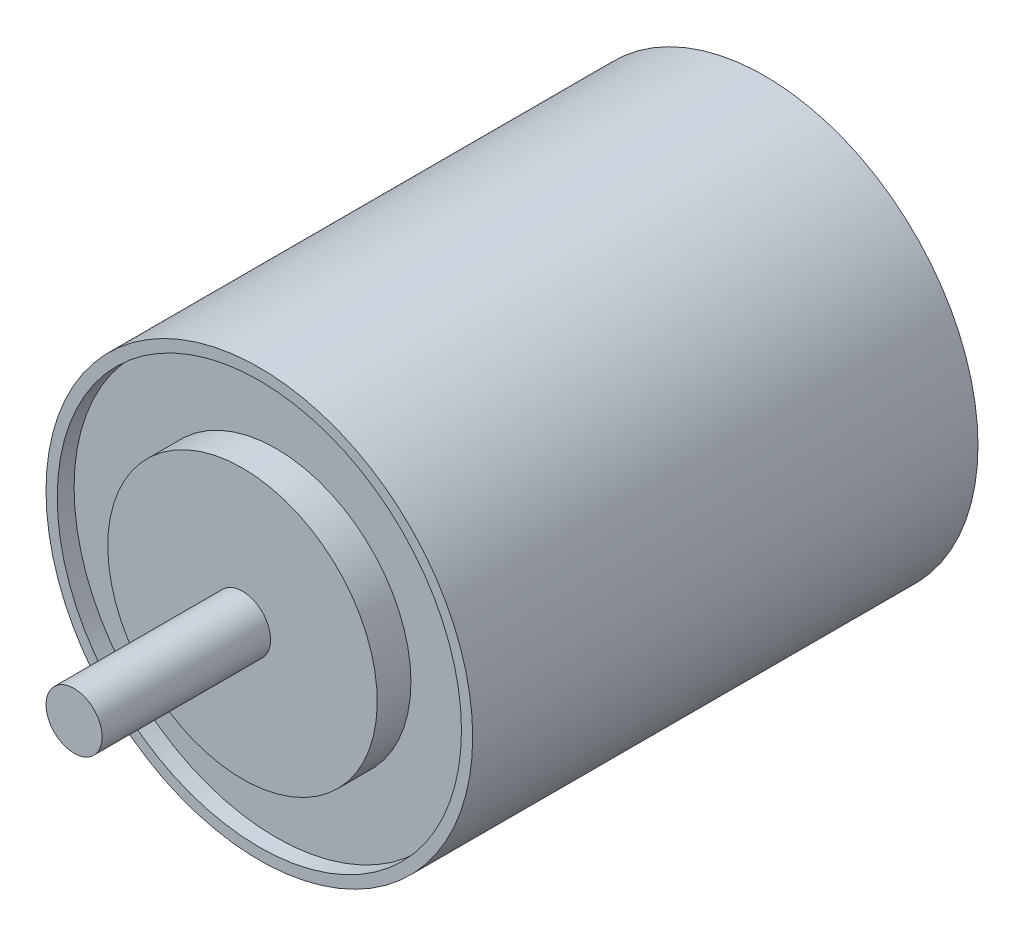
ISO-10303-21;
HEADER;
FILE_DESCRIPTION(('STEP AP214'),'2;1');
FILE_NAME('part.step','',(''),(''),'','','');
FILE_SCHEMA(('AUTOMOTIVE_DESIGN { 1 0 10303 214 1 1 1 1 }'));
ENDSEC;
DATA;
#1=APPLICATION_CONTEXT('core data for automotive mechanical design processes');
#2=APPLICATION_PROTOCOL_DEFINITION('international standard','automotive_design',2000,#1);
#3=PRODUCT_CONTEXT('',#1,'mechanical');
#4=PRODUCT('Part','Part','',(#3));
#5=PRODUCT_RELATED_PRODUCT_CATEGORY('part','',(#4));
#6=PRODUCT_DEFINITION_FORMATION('','',#4);
#7=PRODUCT_DEFINITION_CONTEXT('part definition',#1,'design');
#8=PRODUCT_DEFINITION('design','',#6,#7);
#9=PRODUCT_DEFINITION_SHAPE('','',#8);
#10=(LENGTH_UNIT() NAMED_UNIT(*) SI_UNIT(.MILLI.,.METRE.));
#11=(NAMED_UNIT(*) PLANE_ANGLE_UNIT() SI_UNIT($,.RADIAN.));
#12=(NAMED_UNIT(*) SI_UNIT($,.STERADIAN.) SOLID_ANGLE_UNIT());
#13=UNCERTAINTY_MEASURE_WITH_UNIT(LENGTH_MEASURE(1.E-05),#10,'distance_accuracy_value','');
#14=(GEOMETRIC_REPRESENTATION_CONTEXT(3) GLOBAL_UNCERTAINTY_ASSIGNED_CONTEXT((#13)) GLOBAL_UNIT_ASSIGNED_CONTEXT((#10,
#11,#12)) REPRESENTATION_CONTEXT('',''));
#15=CARTESIAN_POINT('',(0.,0.,0.));
#16=DIRECTION('',(0.,0.,1.));
#17=DIRECTION('',(1.,0.,0.));
#18=AXIS2_PLACEMENT_3D('',#15,#16,#17);
#19=CARTESIAN_POINT('',(0.,-190.,309.593023255814));
#20=DIRECTION('',(0.,0.,1.));
#21=DIRECTION('',(1.,0.,0.));
#22=AXIS2_PLACEMENT_3D('',#19,#20,#21);
#23=PLANE('',#22);
#24=CARTESIAN_POINT('',(0.,-190.,309.593023255814));
#25=DIRECTION('',(0.,0.,1.));
#26=DIRECTION('',(1.,0.,0.));
#27=AXIS2_PLACEMENT_3D('',#24,#25,#26);
#28=CIRCLE('',#27,120.);
#29=CARTESIAN_POINT('',(120.,-190.,309.593023255814));
#30=VERTEX_POINT('',#29);
#31=EDGE_CURVE('E50',#30,#30,#28,.T.);
#32=ORIENTED_EDGE('',*,*,#31,.F.);
#33=EDGE_LOOP('',(#32));
#34=FACE_BOUND('',#33,.T.);
#35=CARTESIAN_POINT('',(0.,-190.,309.593023255814));
#36=DIRECTION('',(0.,0.,1.));
#37=DIRECTION('',(1.,0.,0.));
#38=AXIS2_PLACEMENT_3D('',#35,#36,#37);
#39=CIRCLE('',#38,180.);
#40=CARTESIAN_POINT('',(180.,-190.,309.593023255814));
#41=VERTEX_POINT('',#40);
#42=EDGE_CURVE('E102',#41,#41,#39,.T.);
#43=ORIENTED_EDGE('',*,*,#42,.T.);
#44=EDGE_LOOP('',(#43));
#45=FACE_BOUND('',#44,.T.);
#46=ADVANCED_FACE('F46',(#34,#45),#23,.T.);
#47=CARTESIAN_POINT('',(0.,-190.,309.593023255814));
#48=DIRECTION('',(0.,0.,1.));
#49=DIRECTION('',(1.,0.,0.));
#50=AXIS2_PLACEMENT_3D('',#47,#48,#49);
#51=CYLINDRICAL_SURFACE('',#50,180.);
#52=CARTESIAN_POINT('',(0.,-190.,324.593023255814));
#53=DIRECTION('',(0.,0.,1.));
#54=DIRECTION('',(1.,0.,0.));
#55=AXIS2_PLACEMENT_3D('',#52,#53,#54);
#56=CIRCLE('',#55,180.);
#57=CARTESIAN_POINT('',(180.,-190.,324.593023255814));
#58=VERTEX_POINT('',#57);
#59=EDGE_CURVE('E98',#58,#58,#56,.T.);
#60=ORIENTED_EDGE('',*,*,#59,.T.);
#61=EDGE_LOOP('',(#60));
#62=FACE_BOUND('',#61,.T.);
#63=ORIENTED_EDGE('',*,*,#42,.F.);
#64=EDGE_LOOP('',(#63));
#65=FACE_BOUND('',#64,.T.);
#66=ADVANCED_FACE('F122',(#62,#65),#51,.F.);
#67=CARTESIAN_POINT('',(0.,-10.,324.593023255814));
#68=DIRECTION('',(0.,0.,1.));
#69=DIRECTION('',(1.,0.,0.));
#70=AXIS2_PLACEMENT_3D('',#67,#68,#69);
#71=PLANE('',#70);
#72=CARTESIAN_POINT('',(0.,-190.,324.593023255814));
#73=DIRECTION('',(0.,0.,1.));
#74=DIRECTION('',(1.,0.,0.));
#75=AXIS2_PLACEMENT_3D('',#72,#73,#74);
#76=CIRCLE('',#75,190.);
#77=CARTESIAN_POINT('',(190.,-190.,324.593023255814));
#78=VERTEX_POINT('',#77);
#79=EDGE_CURVE('E94',#78,#78,#76,.T.);
#80=ORIENTED_EDGE('',*,*,#79,.T.);
#81=EDGE_LOOP('',(#80));
#82=FACE_BOUND('',#81,.T.);
#83=ORIENTED_EDGE('',*,*,#59,.F.);
#84=EDGE_LOOP('',(#83));
#85=FACE_BOUND('',#84,.T.);
#86=ADVANCED_FACE('F127',(#82,#85),#71,.T.);
#87=CARTESIAN_POINT('',(0.,-190.,309.593023255814));
#88=DIRECTION('',(0.,0.,1.));
#89=DIRECTION('',(1.,0.,0.));
#90=AXIS2_PLACEMENT_3D('',#87,#88,#89);
#91=CYLINDRICAL_SURFACE('',#90,190.);
#92=CARTESIAN_POINT('',(0.,-190.,-125.406976744186));
#93=DIRECTION('',(0.,0.,1.));
#94=DIRECTION('',(1.,0.,0.));
#95=AXIS2_PLACEMENT_3D('',#92,#93,#94);
#96=CIRCLE('',#95,190.);
#97=CARTESIAN_POINT('',(190.,-190.,-125.406976744186));
#98=VERTEX_POINT('',#97);
#99=EDGE_CURVE('E90',#98,#98,#96,.T.);
#100=ORIENTED_EDGE('',*,*,#99,.T.);
#101=EDGE_LOOP('',(#100));
#102=FACE_BOUND('',#101,.T.);
#103=ORIENTED_EDGE('',*,*,#79,.F.);
#104=EDGE_LOOP('',(#103));
#105=FACE_BOUND('',#104,.T.);
#106=ADVANCED_FACE('F133',(#102,#105),#91,.T.);
#107=CARTESIAN_POINT('',(0.,0.,-125.406976744186));
#108=DIRECTION('',(0.,0.,-1.));
#109=DIRECTION('',(-1.,0.,0.));
#110=AXIS2_PLACEMENT_3D('',#107,#108,#109);
#111=PLANE('',#110);
#112=CARTESIAN_POINT('',(0.,-190.,-125.406976744186));
#113=DIRECTION('',(0.,0.,1.));
#114=DIRECTION('',(1.,0.,0.));
#115=AXIS2_PLACEMENT_3D('',#112,#113,#114);
#116=CIRCLE('',#115,180.);
#117=CARTESIAN_POINT('',(180.,-190.,-125.406976744186));
#118=VERTEX_POINT('',#117);
#119=EDGE_CURVE('E86',#118,#118,#116,.T.);
#120=ORIENTED_EDGE('',*,*,#119,.T.);
#121=EDGE_LOOP('',(#120));
#122=FACE_BOUND('',#121,.T.);
#123=ORIENTED_EDGE('',*,*,#99,.F.);
#124=EDGE_LOOP('',(#123));
#125=FACE_BOUND('',#124,.T.);
#126=ADVANCED_FACE('F162',(#122,#125),#111,.T.);
#127=CARTESIAN_POINT('',(0.,-190.,309.593023255814));
#128=DIRECTION('',(0.,0.,1.));
#129=DIRECTION('',(1.,0.,0.));
#130=AXIS2_PLACEMENT_3D('',#127,#128,#129);
#131=CYLINDRICAL_SURFACE('',#130,180.);
#132=CARTESIAN_POINT('',(0.,-190.,-110.406976744186));
#133=DIRECTION('',(0.,0.,1.));
#134=DIRECTION('',(1.,0.,0.));
#135=AXIS2_PLACEMENT_3D('',#132,#133,#134);
#136=CIRCLE('',#135,180.);
#137=CARTESIAN_POINT('',(180.,-190.,-110.406976744186));
#138=VERTEX_POINT('',#137);
#139=EDGE_CURVE('E79',#138,#138,#136,.T.);
#140=ORIENTED_EDGE('',*,*,#139,.T.);
#141=EDGE_LOOP('',(#140));
#142=FACE_BOUND('',#141,.T.);
#143=ORIENTED_EDGE('',*,*,#119,.F.);
#144=EDGE_LOOP('',(#143));
#145=FACE_BOUND('',#144,.T.);
#146=ADVANCED_FACE('F157',(#142,#145),#131,.F.);
#147=CARTESIAN_POINT('',(0.,-9.99999999999995,-110.406976744186));
#148=DIRECTION('',(0.,0.,-1.));
#149=DIRECTION('',(-1.,0.,0.));
#150=AXIS2_PLACEMENT_3D('',#147,#148,#149);
#151=PLANE('',#150);
#152=CARTESIAN_POINT('',(0.,-190.,-110.406976744186));
#153=DIRECTION('',(0.,0.,-1.));
#154=DIRECTION('',(0.,1.,0.));
#155=AXIS2_PLACEMENT_3D('',#152,#153,#154);
#156=CIRCLE('',#155,120.);
#157=CARTESIAN_POINT('',(0.,-70.,-110.406976744186));
#158=VERTEX_POINT('',#157);
#159=EDGE_CURVE('E74',#158,#158,#156,.T.);
#160=ORIENTED_EDGE('',*,*,#159,.F.);
#161=EDGE_LOOP('',(#160));
#162=FACE_BOUND('',#161,.T.);
#163=ORIENTED_EDGE('',*,*,#139,.F.);
#164=EDGE_LOOP('',(#163));
#165=FACE_BOUND('',#164,.T.);
#166=ADVANCED_FACE('F161',(#162,#165),#151,.T.);
#167=CARTESIAN_POINT('',(0.,-190.,-140.406976744186));
#168=DIRECTION('',(0.,0.,1.));
#169=DIRECTION('',(0.,-1.,0.));
#170=AXIS2_PLACEMENT_3D('',#167,#168,#169);
#171=CYLINDRICAL_SURFACE('',#170,120.);
#172=CARTESIAN_POINT('',(0.,-190.,-140.406976744186));
#173=DIRECTION('',(0.,0.,-1.));
#174=DIRECTION('',(0.,1.,0.));
#175=AXIS2_PLACEMENT_3D('',#172,#173,#174);
#176=CIRCLE('',#175,120.);
#177=CARTESIAN_POINT('',(0.,-70.,-140.406976744186));
#178=VERTEX_POINT('',#177);
#179=EDGE_CURVE('E75',#178,#178,#176,.T.);
#180=ORIENTED_EDGE('',*,*,#179,.F.);
#181=EDGE_LOOP('',(#180));
#182=FACE_BOUND('',#181,.T.);
#183=ORIENTED_EDGE('',*,*,#159,.T.);
#184=EDGE_LOOP('',(#183));
#185=FACE_BOUND('',#184,.T.);
#186=ADVANCED_FACE('F200',(#182,#185),#171,.T.);
#187=CARTESIAN_POINT('',(0.,-190.,-140.406976744186));
#188=DIRECTION('',(0.,0.,-1.));
#189=DIRECTION('',(0.,1.,0.));
#190=AXIS2_PLACEMENT_3D('',#187,#188,#189);
#191=PLANE('',#190);
#192=CARTESIAN_POINT('',(0.,-190.,-140.406976744186));
#193=DIRECTION('',(0.,0.,-1.));
#194=DIRECTION('',(0.,1.,0.));
#195=AXIS2_PLACEMENT_3D('',#192,#193,#194);
#196=CIRCLE('',#195,25.);
#197=CARTESIAN_POINT('',(0.,-165.,-140.406976744186));
#198=VERTEX_POINT('',#197);
#199=EDGE_CURVE('E56',#198,#198,#196,.T.);
#200=ORIENTED_EDGE('',*,*,#199,.F.);
#201=EDGE_LOOP('',(#200));
#202=FACE_BOUND('',#201,.T.);
#203=ORIENTED_EDGE('',*,*,#179,.T.);
#204=EDGE_LOOP('',(#203));
#205=FACE_BOUND('',#204,.T.);
#206=ADVANCED_FACE('F208',(#202,#205),#191,.T.);
#207=CARTESIAN_POINT('',(0.,-190.,339.593023255814));
#208=DIRECTION('',(0.,0.,-1.));
#209=DIRECTION('',(0.,1.,0.));
#210=AXIS2_PLACEMENT_3D('',#207,#208,#209);
#211=CYLINDRICAL_SURFACE('',#210,120.);
#212=CARTESIAN_POINT('',(0.,-190.,339.593023255814));
#213=DIRECTION('',(0.,0.,-1.));
#214=DIRECTION('',(0.,1.,0.));
#215=AXIS2_PLACEMENT_3D('',#212,#213,#214);
#216=CIRCLE('',#215,120.);
#217=CARTESIAN_POINT('',(0.,-70.,339.593023255814));
#218=VERTEX_POINT('',#217);
#219=EDGE_CURVE('E69',#218,#218,#216,.T.);
#220=ORIENTED_EDGE('',*,*,#219,.T.);
#221=EDGE_LOOP('',(#220));
#222=FACE_BOUND('',#221,.T.);
#223=ORIENTED_EDGE('',*,*,#31,.T.);
#224=EDGE_LOOP('',(#223));
#225=FACE_BOUND('',#224,.T.);
#226=ADVANCED_FACE('F118',(#222,#225),#211,.T.);
#227=CARTESIAN_POINT('',(0.,-190.,339.593023255814));
#228=DIRECTION('',(0.,0.,1.));
#229=DIRECTION('',(0.,1.,0.));
#230=AXIS2_PLACEMENT_3D('',#227,#228,#229);
#231=PLANE('',#230);
#232=CARTESIAN_POINT('',(0.,-190.,339.593023255814));
#233=DIRECTION('',(0.,0.,1.));
#234=DIRECTION('',(1.,0.,0.));
#235=AXIS2_PLACEMENT_3D('',#232,#233,#234);
#236=CIRCLE('',#235,25.);
#237=CARTESIAN_POINT('',(25.,-190.,339.593023255814));
#238=VERTEX_POINT('',#237);
#239=EDGE_CURVE('E11',#238,#238,#236,.T.);
#240=ORIENTED_EDGE('',*,*,#239,.F.);
#241=EDGE_LOOP('',(#240));
#242=FACE_BOUND('',#241,.T.);
#243=ORIENTED_EDGE('',*,*,#219,.F.);
#244=EDGE_LOOP('',(#243));
#245=FACE_BOUND('',#244,.T.);
#246=ADVANCED_FACE('F207',(#242,#245),#231,.T.);
#247=CARTESIAN_POINT('',(0.,-190.,-200.406976744186));
#248=DIRECTION('',(0.,0.,1.));
#249=DIRECTION('',(0.,-1.,0.));
#250=AXIS2_PLACEMENT_3D('',#247,#248,#249);
#251=CYLINDRICAL_SURFACE('',#250,25.);
#252=CARTESIAN_POINT('',(0.,-190.,-200.406976744186));
#253=DIRECTION('',(0.,0.,-1.));
#254=DIRECTION('',(0.,1.,0.));
#255=AXIS2_PLACEMENT_3D('',#252,#253,#254);
#256=CIRCLE('',#255,25.);
#257=CARTESIAN_POINT('',(0.,-165.,-200.406976744186));
#258=VERTEX_POINT('',#257);
#259=EDGE_CURVE('E66',#258,#258,#256,.T.);
#260=ORIENTED_EDGE('',*,*,#259,.F.);
#261=EDGE_LOOP('',(#260));
#262=FACE_BOUND('',#261,.T.);
#263=ORIENTED_EDGE('',*,*,#199,.T.);
#264=EDGE_LOOP('',(#263));
#265=FACE_BOUND('',#264,.T.);
#266=ADVANCED_FACE('F223',(#262,#265),#251,.T.);
#267=CARTESIAN_POINT('',(0.,-190.,-200.406976744186));
#268=DIRECTION('',(0.,0.,-1.));
#269=DIRECTION('',(0.,1.,0.));
#270=AXIS2_PLACEMENT_3D('',#267,#268,#269);
#271=PLANE('',#270);
#272=ORIENTED_EDGE('',*,*,#259,.T.);
#273=EDGE_LOOP('',(#272));
#274=FACE_BOUND('',#273,.T.);
#275=ADVANCED_FACE('F227',(#274),#271,.T.);
#276=CARTESIAN_POINT('',(0.,-190.,489.593023255814));
#277=DIRECTION('',(0.,0.,-1.));
#278=DIRECTION('',(-1.,0.,0.));
#279=AXIS2_PLACEMENT_3D('',#276,#277,#278);
#280=CYLINDRICAL_SURFACE('',#279,25.);
#281=CARTESIAN_POINT('',(0.,-190.,489.593023255814));
#282=DIRECTION('',(0.,0.,1.));
#283=DIRECTION('',(1.,0.,0.));
#284=AXIS2_PLACEMENT_3D('',#281,#282,#283);
#285=CIRCLE('',#284,25.);
#286=CARTESIAN_POINT('',(25.,-190.,489.593023255814));
#287=VERTEX_POINT('',#286);
#288=EDGE_CURVE('E65',#287,#287,#285,.T.);
#289=ORIENTED_EDGE('',*,*,#288,.F.);
#290=EDGE_LOOP('',(#289));
#291=FACE_BOUND('',#290,.T.);
#292=ORIENTED_EDGE('',*,*,#239,.T.);
#293=EDGE_LOOP('',(#292));
#294=FACE_BOUND('',#293,.T.);
#295=ADVANCED_FACE('F236',(#291,#294),#280,.T.);
#296=CARTESIAN_POINT('',(0.,-190.,489.593023255814));
#297=DIRECTION('',(0.,0.,1.));
#298=DIRECTION('',(1.,0.,0.));
#299=AXIS2_PLACEMENT_3D('',#296,#297,#298);
#300=PLANE('',#299);
#301=ORIENTED_EDGE('',*,*,#288,.T.);
#302=EDGE_LOOP('',(#301));
#303=FACE_BOUND('',#302,.T.);
#304=ADVANCED_FACE('F252',(#303),#300,.T.);
#305=CLOSED_SHELL('',(#46,#66,#86,#106,#126,#146,#166,#186,#206,#226,#246,#266,#275,#295,#304));
#306=CARTESIAN_POINT('',(0.,-9.99999999999995,-100.406976744186));
#307=DIRECTION('',(0.,0.,-1.));
#308=DIRECTION('',(-1.,0.,0.));
#309=AXIS2_PLACEMENT_3D('',#306,#307,#308);
#310=PLANE('',#309);
#311=CARTESIAN_POINT('',(0.,-190.,-100.406976744186));
#312=DIRECTION('',(0.,0.,1.));
#313=DIRECTION('',(1.,0.,0.));
#314=AXIS2_PLACEMENT_3D('',#311,#312,#313);
#315=CIRCLE('',#314,180.);
#316=CARTESIAN_POINT('',(180.,-190.,-100.406976744186));
#317=VERTEX_POINT('',#316);
#318=EDGE_CURVE('E109',#317,#317,#315,.T.);
#319=ORIENTED_EDGE('',*,*,#318,.T.);
#320=EDGE_LOOP('',(#319));
#321=FACE_BOUND('',#320,.T.);
#322=ADVANCED_FACE('F48',(#321),#310,.F.);
#323=CARTESIAN_POINT('',(0.,-190.,309.593023255814));
#324=DIRECTION('',(0.,0.,1.));
#325=DIRECTION('',(1.,0.,0.));
#326=AXIS2_PLACEMENT_3D('',#323,#324,#325);
#327=CYLINDRICAL_SURFACE('',#326,180.);
#328=ORIENTED_EDGE('',*,*,#318,.F.);
#329=EDGE_LOOP('',(#328));
#330=FACE_BOUND('',#329,.T.);
#331=CARTESIAN_POINT('',(0.,-190.,299.593023255814));
#332=DIRECTION('',(0.,0.,1.));
#333=DIRECTION('',(1.,0.,0.));
#334=AXIS2_PLACEMENT_3D('',#331,#332,#333);
#335=CIRCLE('',#334,180.);
#336=CARTESIAN_POINT('',(180.,-190.,299.593023255814));
#337=VERTEX_POINT('',#336);
#338=EDGE_CURVE('E106',#337,#337,#335,.T.);
#339=ORIENTED_EDGE('',*,*,#338,.T.);
#340=EDGE_LOOP('',(#339));
#341=FACE_BOUND('',#340,.T.);
#342=ADVANCED_FACE('F140',(#330,#341),#327,.F.);
#343=CARTESIAN_POINT('',(0.,-190.,299.593023255814));
#344=DIRECTION('',(0.,0.,1.));
#345=DIRECTION('',(1.,0.,0.));
#346=AXIS2_PLACEMENT_3D('',#343,#344,#345);
#347=PLANE('',#346);
#348=ORIENTED_EDGE('',*,*,#338,.F.);
#349=EDGE_LOOP('',(#348));
#350=FACE_BOUND('',#349,.T.);
#351=ADVANCED_FACE('F138',(#350),#347,.F.);
#352=CLOSED_SHELL('',(#322,#342,#351));
#353=ORIENTED_CLOSED_SHELL('',*,#352,.T.);
#354=BREP_WITH_VOIDS('B2',#305,(#353));
#355=ADVANCED_BREP_SHAPE_REPRESENTATION('',(#18,#354),#14);
#356=SHAPE_DEFINITION_REPRESENTATION(#9,#355);
ENDSEC;
END-ISO-10303-21;
